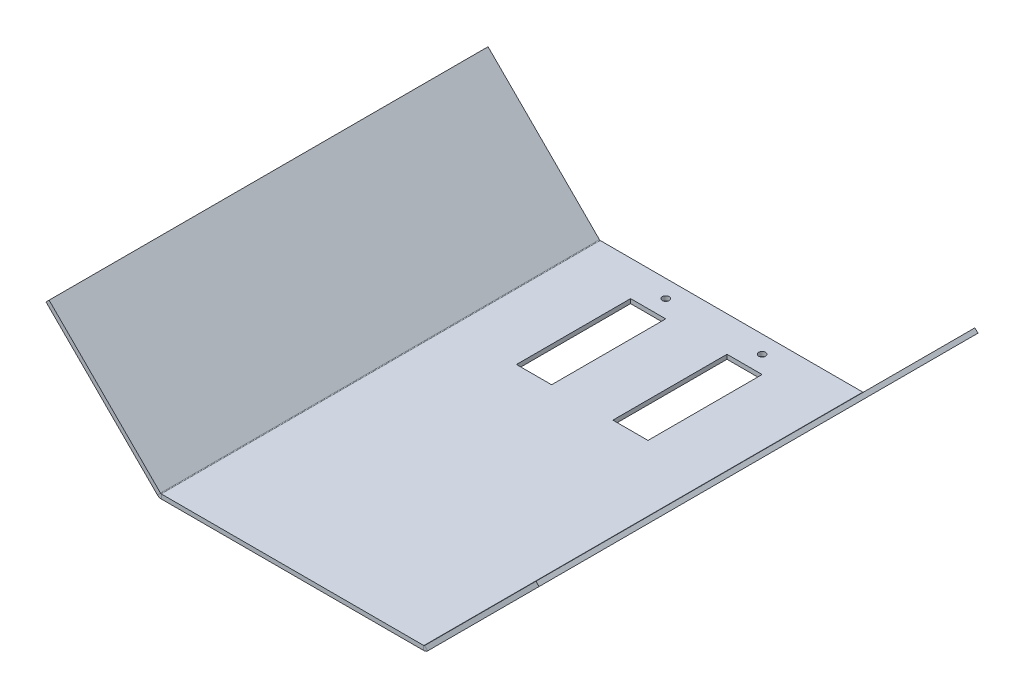
ISO-10303-21;
HEADER;
FILE_DESCRIPTION(('STEP AP214'),'2;1');
FILE_NAME('part.step','',(''),(''),'','','');
FILE_SCHEMA(('AUTOMOTIVE_DESIGN { 1 0 10303 214 1 1 1 1 }'));
ENDSEC;
DATA;
#1=APPLICATION_CONTEXT('core data for automotive mechanical design processes');
#2=APPLICATION_PROTOCOL_DEFINITION('international standard','automotive_design',2000,#1);
#3=PRODUCT_CONTEXT('',#1,'mechanical');
#4=PRODUCT('Part','Part','',(#3));
#5=PRODUCT_RELATED_PRODUCT_CATEGORY('part','',(#4));
#6=PRODUCT_DEFINITION_FORMATION('','',#4);
#7=PRODUCT_DEFINITION_CONTEXT('part definition',#1,'design');
#8=PRODUCT_DEFINITION('design','',#6,#7);
#9=PRODUCT_DEFINITION_SHAPE('','',#8);
#10=(LENGTH_UNIT() NAMED_UNIT(*) SI_UNIT(.MILLI.,.METRE.));
#11=(NAMED_UNIT(*) PLANE_ANGLE_UNIT() SI_UNIT($,.RADIAN.));
#12=(NAMED_UNIT(*) SI_UNIT($,.STERADIAN.) SOLID_ANGLE_UNIT());
#13=UNCERTAINTY_MEASURE_WITH_UNIT(LENGTH_MEASURE(1.E-05),#10,'distance_accuracy_value','');
#14=(GEOMETRIC_REPRESENTATION_CONTEXT(3) GLOBAL_UNCERTAINTY_ASSIGNED_CONTEXT((#13)) GLOBAL_UNIT_ASSIGNED_CONTEXT((#10,
#11,#12)) REPRESENTATION_CONTEXT('',''));
#15=CARTESIAN_POINT('',(0.,0.,0.));
#16=DIRECTION('',(0.,0.,1.));
#17=DIRECTION('',(1.,0.,0.));
#18=AXIS2_PLACEMENT_3D('',#15,#16,#17);
#19=CARTESIAN_POINT('',(0.336672783496916,0.,158.75));
#20=DIRECTION('',(0.,0.,1.));
#21=DIRECTION('',(1.,0.,0.));
#22=AXIS2_PLACEMENT_3D('',#19,#20,#21);
#23=PLANE('',#22);
#24=DIRECTION('',(0.,-1.,0.));
#25=VECTOR('',#24,1.);
#26=CARTESIAN_POINT('',(0.336672783496916,0.,158.75));
#27=LINE('',#26,#25);
#28=CARTESIAN_POINT('',(0.336672783496916,0.,158.75));
#29=VERTEX_POINT('',#28);
#30=CARTESIAN_POINT('',(0.336672783496916,-3.175,158.75));
#31=VERTEX_POINT('',#30);
#32=EDGE_CURVE('E11',#29,#31,#27,.T.);
#33=ORIENTED_EDGE('',*,*,#32,.F.);
#34=CARTESIAN_POINT('',(0.336672783496916,0.812799999999973,158.75));
#35=DIRECTION('',(0.,0.,-1.));
#36=DIRECTION('',(-1.,0.,0.));
#37=AXIS2_PLACEMENT_3D('',#34,#35,#36);
#38=CIRCLE('',#37,0.8128);
#39=CARTESIAN_POINT('',(-0.238063608251474,0.238063608251488,158.75));
#40=VERTEX_POINT('',#39);
#41=EDGE_CURVE('E326',#40,#29,#38,.F.);
#42=ORIENTED_EDGE('',*,*,#41,.F.);
#43=DIRECTION('',(0.707106781186488,0.707106781186607,0.));
#44=VECTOR('',#43,1.);
#45=CARTESIAN_POINT('',(-2.48312763851856,-2.00700042201598,158.75));
#46=LINE('',#45,#44);
#47=CARTESIAN_POINT('',(-2.48312763851856,-2.00700042201598,158.75));
#48=VERTEX_POINT('',#47);
#49=EDGE_CURVE('E51',#48,#40,#46,.T.);
#50=ORIENTED_EDGE('',*,*,#49,.F.);
#51=CARTESIAN_POINT('',(0.336672783496916,0.812799999999973,158.75));
#52=DIRECTION('',(0.,0.,1.));
#53=DIRECTION('',(1.,0.,0.));
#54=AXIS2_PLACEMENT_3D('',#51,#52,#53);
#55=CIRCLE('',#54,3.9878);
#56=EDGE_CURVE('E338',#48,#31,#55,.T.);
#57=ORIENTED_EDGE('',*,*,#56,.T.);
#58=EDGE_LOOP('',(#33,#42,#50,#57));
#59=FACE_BOUND('',#58,.T.);
#60=ADVANCED_FACE('F44',(#59),#23,.T.);
#61=CARTESIAN_POINT('',(-2.48312763851856,-2.00700042201598,158.75));
#62=DIRECTION('',(0.,0.,1.));
#63=DIRECTION('',(1.,0.,0.));
#64=AXIS2_PLACEMENT_3D('',#61,#62,#63);
#65=PLANE('',#64);
#66=DIRECTION('',(1.,0.,0.));
#67=VECTOR('',#66,1.);
#68=CARTESIAN_POINT('',(0.,0.,158.75));
#69=LINE('',#68,#67);
#70=CARTESIAN_POINT('',(190.163327216503,0.,158.75));
#71=VERTEX_POINT('',#70);
#72=EDGE_CURVE('E323',#29,#71,#69,.T.);
#73=ORIENTED_EDGE('',*,*,#72,.F.);
#74=ORIENTED_EDGE('',*,*,#32,.T.);
#75=DIRECTION('',(1.,0.,0.));
#76=VECTOR('',#75,1.);
#77=CARTESIAN_POINT('',(0.,-3.175,158.75));
#78=LINE('',#77,#76);
#79=CARTESIAN_POINT('',(190.163327216503,-3.175,158.75));
#80=VERTEX_POINT('',#79);
#81=EDGE_CURVE('E341',#31,#80,#78,.T.);
#82=ORIENTED_EDGE('',*,*,#81,.T.);
#83=DIRECTION('',(0.,1.,0.));
#84=VECTOR('',#83,1.);
#85=CARTESIAN_POINT('',(190.163327216503,-3.175,158.75));
#86=LINE('',#85,#84);
#87=EDGE_CURVE('E417',#80,#71,#86,.T.);
#88=ORIENTED_EDGE('',*,*,#87,.T.);
#89=EDGE_LOOP('',(#73,#74,#82,#88));
#90=FACE_BOUND('',#89,.T.);
#91=ADVANCED_FACE('F459',(#90),#65,.T.);
#92=CARTESIAN_POINT('',(-0.238063608251474,0.238063608251488,-158.75));
#93=DIRECTION('',(0.,0.,-1.));
#94=DIRECTION('',(-1.,0.,0.));
#95=AXIS2_PLACEMENT_3D('',#92,#93,#94);
#96=PLANE('',#95);
#97=DIRECTION('',(-0.707106781186488,-0.707106781186607,0.));
#98=VECTOR('',#97,1.);
#99=CARTESIAN_POINT('',(-0.238063608251474,0.238063608251488,-158.75));
#100=LINE('',#99,#98);
#101=CARTESIAN_POINT('',(-0.238063608251474,0.238063608251488,-158.75));
#102=VERTEX_POINT('',#101);
#103=CARTESIAN_POINT('',(-2.48312763851856,-2.00700042201598,-158.75));
#104=VERTEX_POINT('',#103);
#105=EDGE_CURVE('E423',#102,#104,#100,.T.);
#106=ORIENTED_EDGE('',*,*,#105,.F.);
#107=CARTESIAN_POINT('',(0.336672783496916,0.812799999999973,-158.75));
#108=DIRECTION('',(0.,0.,-1.));
#109=DIRECTION('',(-1.,0.,0.));
#110=AXIS2_PLACEMENT_3D('',#107,#108,#109);
#111=CIRCLE('',#110,0.8128);
#112=CARTESIAN_POINT('',(0.336672783496916,0.,-158.75));
#113=VERTEX_POINT('',#112);
#114=EDGE_CURVE('E362',#102,#113,#111,.F.);
#115=ORIENTED_EDGE('',*,*,#114,.T.);
#116=DIRECTION('',(0.,1.,0.));
#117=VECTOR('',#116,1.);
#118=CARTESIAN_POINT('',(0.336672783496916,-3.175,-158.75));
#119=LINE('',#118,#117);
#120=CARTESIAN_POINT('',(0.336672783496916,-3.175,-158.75));
#121=VERTEX_POINT('',#120);
#122=EDGE_CURVE('E421',#121,#113,#119,.T.);
#123=ORIENTED_EDGE('',*,*,#122,.F.);
#124=CARTESIAN_POINT('',(0.336672783496916,0.812799999999973,-158.75));
#125=DIRECTION('',(0.,0.,1.));
#126=DIRECTION('',(1.,0.,0.));
#127=AXIS2_PLACEMENT_3D('',#124,#125,#126);
#128=CIRCLE('',#127,3.9878);
#129=EDGE_CURVE('E374',#104,#121,#128,.T.);
#130=ORIENTED_EDGE('',*,*,#129,.F.);
#131=EDGE_LOOP('',(#106,#115,#123,#130));
#132=FACE_BOUND('',#131,.T.);
#133=ADVANCED_FACE('F467',(#132),#96,.T.);
#134=CARTESIAN_POINT('',(0.336672783496916,-3.175,-158.75));
#135=DIRECTION('',(0.,0.,-1.));
#136=DIRECTION('',(-1.,0.,0.));
#137=AXIS2_PLACEMENT_3D('',#134,#135,#136);
#138=PLANE('',#137);
#139=DIRECTION('',(0.707106781186547,-0.707106781186549,0.));
#140=VECTOR('',#139,1.);
#141=CARTESIAN_POINT('',(-80.8223050896222,80.8223050896225,-158.75));
#142=LINE('',#141,#140);
#143=CARTESIAN_POINT('',(-80.8223050896222,80.8223050896225,-158.75));
#144=VERTEX_POINT('',#143);
#145=EDGE_CURVE('E365',#144,#102,#142,.T.);
#146=ORIENTED_EDGE('',*,*,#145,.T.);
#147=ORIENTED_EDGE('',*,*,#105,.T.);
#148=DIRECTION('',(0.707106781186546,-0.707106781186549,0.));
#149=VECTOR('',#148,1.);
#150=CARTESIAN_POINT('',(-83.0673691198895,78.5772410593552,-158.75));
#151=LINE('',#150,#149);
#152=CARTESIAN_POINT('',(-83.0673691198895,78.5772410593552,-158.75));
#153=VERTEX_POINT('',#152);
#154=EDGE_CURVE('E371',#153,#104,#151,.T.);
#155=ORIENTED_EDGE('',*,*,#154,.F.);
#156=DIRECTION('',(0.70710678118655,0.707106781186545,0.));
#157=VECTOR('',#156,1.);
#158=CARTESIAN_POINT('',(-83.0673691198895,78.5772410593552,-158.75));
#159=LINE('',#158,#157);
#160=EDGE_CURVE('E368',#153,#144,#159,.T.);
#161=ORIENTED_EDGE('',*,*,#160,.T.);
#162=EDGE_LOOP('',(#146,#147,#155,#161));
#163=FACE_BOUND('',#162,.T.);
#164=ADVANCED_FACE('F469',(#163),#138,.T.);
#165=CARTESIAN_POINT('',(190.738063608252,0.238063608251572,158.75));
#166=DIRECTION('',(0.,0.,1.));
#167=DIRECTION('',(1.,0.,0.));
#168=AXIS2_PLACEMENT_3D('',#165,#166,#167);
#169=PLANE('',#168);
#170=DIRECTION('',(0.707106781186547,-0.707106781186548,0.));
#171=VECTOR('',#170,1.);
#172=CARTESIAN_POINT('',(190.738063608252,0.238063608251572,158.75));
#173=LINE('',#172,#171);
#174=CARTESIAN_POINT('',(190.738063608252,0.238063608251572,158.75));
#175=VERTEX_POINT('',#174);
#176=CARTESIAN_POINT('',(192.983127638519,-2.00700042201571,158.75));
#177=VERTEX_POINT('',#176);
#178=EDGE_CURVE('E419',#175,#177,#173,.T.);
#179=ORIENTED_EDGE('',*,*,#178,.F.);
#180=CARTESIAN_POINT('',(190.163327216503,0.812800000000002,158.75));
#181=DIRECTION('',(0.,0.,-1.));
#182=DIRECTION('',(-1.,0.,0.));
#183=AXIS2_PLACEMENT_3D('',#180,#181,#182);
#184=CIRCLE('',#183,0.8128);
#185=EDGE_CURVE('E320',#71,#175,#184,.F.);
#186=ORIENTED_EDGE('',*,*,#185,.F.);
#187=ORIENTED_EDGE('',*,*,#87,.F.);
#188=CARTESIAN_POINT('',(190.163327216503,0.812800000000002,158.75));
#189=DIRECTION('',(0.,0.,1.));
#190=DIRECTION('',(1.,0.,0.));
#191=AXIS2_PLACEMENT_3D('',#188,#189,#190);
#192=CIRCLE('',#191,3.9878);
#193=EDGE_CURVE('E344',#80,#177,#192,.T.);
#194=ORIENTED_EDGE('',*,*,#193,.T.);
#195=EDGE_LOOP('',(#179,#186,#187,#194));
#196=FACE_BOUND('',#195,.T.);
#197=ADVANCED_FACE('F471',(#196),#169,.T.);
#198=CARTESIAN_POINT('',(190.163327216503,-3.175,158.75));
#199=DIRECTION('',(0.,0.,1.));
#200=DIRECTION('',(1.,0.,0.));
#201=AXIS2_PLACEMENT_3D('',#198,#199,#200);
#202=PLANE('',#201);
#203=DIRECTION('',(0.707106781186546,0.707106781186549,0.));
#204=VECTOR('',#203,1.);
#205=CARTESIAN_POINT('',(190.5,0.,158.75));
#206=LINE('',#205,#204);
#207=CARTESIAN_POINT('',(271.322305089622,80.8223050896225,158.75));
#208=VERTEX_POINT('',#207);
#209=EDGE_CURVE('E317',#175,#208,#206,.T.);
#210=ORIENTED_EDGE('',*,*,#209,.F.);
#211=ORIENTED_EDGE('',*,*,#178,.T.);
#212=DIRECTION('',(0.707106781186546,0.707106781186549,0.));
#213=VECTOR('',#212,1.);
#214=CARTESIAN_POINT('',(192.745064030267,-2.24506403026728,158.75));
#215=LINE('',#214,#213);
#216=CARTESIAN_POINT('',(273.56736911989,78.5772410593552,158.75));
#217=VERTEX_POINT('',#216);
#218=EDGE_CURVE('E311',#177,#217,#215,.T.);
#219=ORIENTED_EDGE('',*,*,#218,.T.);
#220=DIRECTION('',(0.707106781186552,-0.707106781186543,0.));
#221=VECTOR('',#220,1.);
#222=CARTESIAN_POINT('',(271.322305089622,80.8223050896225,158.75));
#223=LINE('',#222,#221);
#224=EDGE_CURVE('E313',#208,#217,#223,.T.);
#225=ORIENTED_EDGE('',*,*,#224,.F.);
#226=EDGE_LOOP('',(#210,#211,#219,#225));
#227=FACE_BOUND('',#226,.T.);
#228=ADVANCED_FACE('F477',(#227),#202,.T.);
#229=CARTESIAN_POINT('',(190.163327216503,0.,-158.75));
#230=DIRECTION('',(0.,0.,-1.));
#231=DIRECTION('',(-1.,0.,0.));
#232=AXIS2_PLACEMENT_3D('',#229,#230,#231);
#233=PLANE('',#232);
#234=DIRECTION('',(0.,-1.,0.));
#235=VECTOR('',#234,1.);
#236=CARTESIAN_POINT('',(190.163327216503,0.,-158.75));
#237=LINE('',#236,#235);
#238=CARTESIAN_POINT('',(190.163327216503,0.,-158.75));
#239=VERTEX_POINT('',#238);
#240=CARTESIAN_POINT('',(190.163327216503,-3.175,-158.75));
#241=VERTEX_POINT('',#240);
#242=EDGE_CURVE('E415',#239,#241,#237,.T.);
#243=ORIENTED_EDGE('',*,*,#242,.F.);
#244=CARTESIAN_POINT('',(190.163327216503,0.812800000000002,-158.75));
#245=DIRECTION('',(0.,0.,-1.));
#246=DIRECTION('',(-1.,0.,0.));
#247=AXIS2_PLACEMENT_3D('',#244,#245,#246);
#248=CIRCLE('',#247,0.8128);
#249=CARTESIAN_POINT('',(190.738063608252,0.238063608251572,-158.75));
#250=VERTEX_POINT('',#249);
#251=EDGE_CURVE('E356',#239,#250,#248,.F.);
#252=ORIENTED_EDGE('',*,*,#251,.T.);
#253=DIRECTION('',(-0.707106781186547,0.707106781186548,0.));
#254=VECTOR('',#253,1.);
#255=CARTESIAN_POINT('',(192.983127638519,-2.00700042201571,-158.75));
#256=LINE('',#255,#254);
#257=CARTESIAN_POINT('',(192.983127638519,-2.00700042201571,-158.75));
#258=VERTEX_POINT('',#257);
#259=EDGE_CURVE('E413',#258,#250,#256,.T.);
#260=ORIENTED_EDGE('',*,*,#259,.F.);
#261=CARTESIAN_POINT('',(190.163327216503,0.812800000000002,-158.75));
#262=DIRECTION('',(0.,0.,1.));
#263=DIRECTION('',(1.,0.,0.));
#264=AXIS2_PLACEMENT_3D('',#261,#262,#263);
#265=CIRCLE('',#264,3.9878);
#266=EDGE_CURVE('E314',#241,#258,#265,.T.);
#267=ORIENTED_EDGE('',*,*,#266,.F.);
#268=EDGE_LOOP('',(#243,#252,#260,#267));
#269=FACE_BOUND('',#268,.T.);
#270=ADVANCED_FACE('F515',(#269),#233,.T.);
#271=CARTESIAN_POINT('',(192.983127638519,-2.00700042201571,-158.75));
#272=DIRECTION('',(0.,0.,-1.));
#273=DIRECTION('',(-1.,0.,0.));
#274=AXIS2_PLACEMENT_3D('',#271,#272,#273);
#275=PLANE('',#274);
#276=DIRECTION('',(1.,0.,0.));
#277=VECTOR('',#276,1.);
#278=CARTESIAN_POINT('',(0.,0.,-158.75));
#279=LINE('',#278,#277);
#280=EDGE_CURVE('E359',#113,#239,#279,.T.);
#281=ORIENTED_EDGE('',*,*,#280,.T.);
#282=ORIENTED_EDGE('',*,*,#242,.T.);
#283=DIRECTION('',(1.,0.,0.));
#284=VECTOR('',#283,1.);
#285=CARTESIAN_POINT('',(0.,-3.175,-158.75));
#286=LINE('',#285,#284);
#287=EDGE_CURVE('E377',#121,#241,#286,.T.);
#288=ORIENTED_EDGE('',*,*,#287,.F.);
#289=ORIENTED_EDGE('',*,*,#122,.T.);
#290=EDGE_LOOP('',(#281,#282,#288,#289));
#291=FACE_BOUND('',#290,.T.);
#292=ADVANCED_FACE('F526',(#291),#275,.T.);
#293=CARTESIAN_POINT('',(192.745064030267,-2.24506403026728,158.75));
#294=DIRECTION('',(-0.707106781186549,0.707106781186546,0.));
#295=DIRECTION('',(-0.707106781186546,-0.707106781186549,0.));
#296=AXIS2_PLACEMENT_3D('',#293,#294,#295);
#297=PLANE('',#296);
#298=DIRECTION('',(-0.707106781186546,-0.707106781186549,0.));
#299=VECTOR('',#298,1.);
#300=CARTESIAN_POINT('',(204.801696022067,9.81156796153279,-150.8125));
#301=LINE('',#300,#299);
#302=CARTESIAN_POINT('',(207.046759442645,12.05663138211,-150.8125));
#303=VERTEX_POINT('',#302);
#304=CARTESIAN_POINT('',(204.801695412377,9.81156735184285,-150.8125));
#305=VERTEX_POINT('',#304);
#306=EDGE_CURVE('E205',#303,#305,#301,.T.);
#307=ORIENTED_EDGE('',*,*,#306,.T.);
#308=CARTESIAN_POINT('',(204.801695412377,9.81156735184285,-146.05));
#309=DIRECTION('',(-0.707106781186549,0.707106781186546,0.));
#310=DIRECTION('',(-0.707106781186546,-0.707106781186549,0.));
#311=AXIS2_PLACEMENT_3D('',#308,#309,#310);
#312=ELLIPSE('',#311,6.73519209080189,4.76250000000001);
#313=CARTESIAN_POINT('',(204.801695412378,9.81156735184333,-141.2875));
#314=VERTEX_POINT('',#313);
#315=EDGE_CURVE('E216',#305,#314,#312,.T.);
#316=ORIENTED_EDGE('',*,*,#315,.T.);
#317=DIRECTION('',(0.707106781186545,0.70710678118655,0.));
#318=VECTOR('',#317,1.);
#319=CARTESIAN_POINT('',(207.046757967817,12.0566299072826,-141.2875));
#320=LINE('',#319,#318);
#321=CARTESIAN_POINT('',(207.046759442645,12.0566313821106,-141.2875));
#322=VERTEX_POINT('',#321);
#323=EDGE_CURVE('E206',#314,#322,#320,.T.);
#324=ORIENTED_EDGE('',*,*,#323,.T.);
#325=CARTESIAN_POINT('',(207.046759442645,12.0566313821101,-146.05));
#326=DIRECTION('',(-0.707106781186549,0.707106781186546,0.));
#327=DIRECTION('',(-0.707106781186546,-0.707106781186549,0.));
#328=AXIS2_PLACEMENT_3D('',#325,#326,#327);
#329=ELLIPSE('',#328,6.73519209080189,4.76250000000001);
#330=EDGE_CURVE('E200',#322,#303,#329,.T.);
#331=ORIENTED_EDGE('',*,*,#330,.T.);
#332=EDGE_LOOP('',(#307,#316,#324,#331));
#333=FACE_BOUND('',#332,.T.);
#334=DIRECTION('',(0.707106781186546,0.707106781186549,0.));
#335=VECTOR('',#334,1.);
#336=CARTESIAN_POINT('',(192.745064030267,-2.24506403026728,-158.75));
#337=LINE('',#336,#335);
#338=CARTESIAN_POINT('',(273.56736911989,78.5772410593552,-158.75));
#339=VERTEX_POINT('',#338);
#340=EDGE_CURVE('E304',#258,#339,#337,.T.);
#341=ORIENTED_EDGE('',*,*,#340,.T.);
#342=DIRECTION('',(0.,0.,-1.));
#343=VECTOR('',#342,1.);
#344=CARTESIAN_POINT('',(273.56736911989,78.5772410593552,158.75));
#345=LINE('',#344,#343);
#346=EDGE_CURVE('E411',#217,#339,#345,.T.);
#347=ORIENTED_EDGE('',*,*,#346,.F.);
#348=ORIENTED_EDGE('',*,*,#218,.F.);
#349=DIRECTION('',(0.,0.,-1.));
#350=VECTOR('',#349,1.);
#351=CARTESIAN_POINT('',(192.983127638519,-2.00700042201571,158.75));
#352=LINE('',#351,#350);
#353=EDGE_CURVE('E347',#177,#258,#352,.T.);
#354=ORIENTED_EDGE('',*,*,#353,.T.);
#355=EDGE_LOOP('',(#341,#347,#348,#354));
#356=FACE_BOUND('',#355,.T.);
#357=ADVANCED_FACE('F219',(#333,#356),#297,.F.);
#358=CARTESIAN_POINT('',(271.322305089622,80.8223050896225,158.75));
#359=DIRECTION('',(0.707106781186543,0.707106781186552,0.));
#360=DIRECTION('',(-0.707106781186552,0.707106781186543,0.));
#361=AXIS2_PLACEMENT_3D('',#358,#359,#360);
#362=PLANE('',#361);
#363=DIRECTION('',(0.707106781186552,-0.707106781186543,0.));
#364=VECTOR('',#363,1.);
#365=CARTESIAN_POINT('',(271.322305089622,80.8223050896225,-158.75));
#366=LINE('',#365,#364);
#367=CARTESIAN_POINT('',(271.322305089622,80.8223050896225,-158.75));
#368=VERTEX_POINT('',#367);
#369=EDGE_CURVE('E350',#368,#339,#366,.T.);
#370=ORIENTED_EDGE('',*,*,#369,.F.);
#371=DIRECTION('',(0.,0.,-1.));
#372=VECTOR('',#371,1.);
#373=CARTESIAN_POINT('',(271.322305089622,80.8223050896225,158.75));
#374=LINE('',#373,#372);
#375=EDGE_CURVE('E409',#208,#368,#374,.T.);
#376=ORIENTED_EDGE('',*,*,#375,.F.);
#377=ORIENTED_EDGE('',*,*,#224,.T.);
#378=ORIENTED_EDGE('',*,*,#346,.T.);
#379=EDGE_LOOP('',(#370,#376,#377,#378));
#380=FACE_BOUND('',#379,.T.);
#381=ADVANCED_FACE('F547',(#380),#362,.T.);
#382=CARTESIAN_POINT('',(190.5,0.,158.75));
#383=DIRECTION('',(-0.707106781186549,0.707106781186546,0.));
#384=DIRECTION('',(-0.707106781186546,-0.707106781186549,0.));
#385=AXIS2_PLACEMENT_3D('',#382,#383,#384);
#386=PLANE('',#385);
#387=CARTESIAN_POINT('',(202.55663138211,12.0566313821101,-146.05));
#388=DIRECTION('',(-0.707106781186549,0.707106781186546,0.));
#389=DIRECTION('',(-0.707106781186546,-0.707106781186549,0.));
#390=AXIS2_PLACEMENT_3D('',#387,#388,#389);
#391=ELLIPSE('',#390,6.73519209080189,4.76250000000001);
#392=CARTESIAN_POINT('',(202.55663138211,12.0566313821101,-150.8125));
#393=VERTEX_POINT('',#392);
#394=CARTESIAN_POINT('',(202.55663138211,12.0566313821104,-141.2875));
#395=VERTEX_POINT('',#394);
#396=EDGE_CURVE('E221',#393,#395,#391,.T.);
#397=ORIENTED_EDGE('',*,*,#396,.F.);
#398=DIRECTION('',(-0.707106781186547,-0.707106781186548,0.));
#399=VECTOR('',#398,1.);
#400=CARTESIAN_POINT('',(203.679163397244,13.1791633972438,-150.8125));
#401=LINE('',#400,#399);
#402=CARTESIAN_POINT('',(204.801695412377,14.3016954123774,-150.8125));
#403=VERTEX_POINT('',#402);
#404=EDGE_CURVE('E223',#403,#393,#401,.T.);
#405=ORIENTED_EDGE('',*,*,#404,.F.);
#406=CARTESIAN_POINT('',(204.801695412377,14.3016954123774,-146.05));
#407=DIRECTION('',(-0.707106781186549,0.707106781186546,0.));
#408=DIRECTION('',(-0.707106781186546,-0.707106781186549,0.));
#409=AXIS2_PLACEMENT_3D('',#406,#407,#408);
#410=ELLIPSE('',#409,6.73519209080189,4.76250000000001);
#411=CARTESIAN_POINT('',(204.801695412378,14.3016954123775,-141.2875));
#412=VERTEX_POINT('',#411);
#413=EDGE_CURVE('E232',#412,#403,#410,.T.);
#414=ORIENTED_EDGE('',*,*,#413,.F.);
#415=DIRECTION('',(-0.707106781186547,-0.707106781186548,0.));
#416=VECTOR('',#415,1.);
#417=CARTESIAN_POINT('',(203.679163397244,13.1791633972438,-141.2875));
#418=LINE('',#417,#416);
#419=EDGE_CURVE('E213',#395,#412,#418,.F.);
#420=ORIENTED_EDGE('',*,*,#419,.F.);
#421=EDGE_LOOP('',(#397,#405,#414,#420));
#422=FACE_BOUND('',#421,.T.);
#423=DIRECTION('',(0.707106781186546,0.707106781186549,0.));
#424=VECTOR('',#423,1.);
#425=CARTESIAN_POINT('',(190.5,0.,-158.75));
#426=LINE('',#425,#424);
#427=EDGE_CURVE('E353',#250,#368,#426,.T.);
#428=ORIENTED_EDGE('',*,*,#427,.F.);
#429=DIRECTION('',(0.,0.,-1.));
#430=VECTOR('',#429,1.);
#431=CARTESIAN_POINT('',(190.738063608252,0.238063608251572,158.75));
#432=LINE('',#431,#430);
#433=EDGE_CURVE('E406',#175,#250,#432,.T.);
#434=ORIENTED_EDGE('',*,*,#433,.F.);
#435=ORIENTED_EDGE('',*,*,#209,.T.);
#436=ORIENTED_EDGE('',*,*,#375,.T.);
#437=EDGE_LOOP('',(#428,#434,#435,#436));
#438=FACE_BOUND('',#437,.T.);
#439=ADVANCED_FACE('F558',(#422,#438),#386,.T.);
#440=CARTESIAN_POINT('',(190.163327216503,0.812800000000002,158.75));
#441=DIRECTION('',(0.,0.,-1.));
#442=DIRECTION('',(-1.,0.,0.));
#443=AXIS2_PLACEMENT_3D('',#440,#441,#442);
#444=CYLINDRICAL_SURFACE('',#443,0.8128);
#445=ORIENTED_EDGE('',*,*,#251,.F.);
#446=DIRECTION('',(0.,0.,-1.));
#447=VECTOR('',#446,1.);
#448=CARTESIAN_POINT('',(190.163327216503,0.,158.75));
#449=LINE('',#448,#447);
#450=EDGE_CURVE('E403',#71,#239,#449,.T.);
#451=ORIENTED_EDGE('',*,*,#450,.F.);
#452=ORIENTED_EDGE('',*,*,#185,.T.);
#453=ORIENTED_EDGE('',*,*,#433,.T.);
#454=EDGE_LOOP('',(#445,#451,#452,#453));
#455=FACE_BOUND('',#454,.T.);
#456=ADVANCED_FACE('F569',(#455),#444,.F.);
#457=CARTESIAN_POINT('',(0.,0.,158.75));
#458=DIRECTION('',(0.,1.,0.));
#459=DIRECTION('',(0.,0.,1.));
#460=AXIS2_PLACEMENT_3D('',#457,#458,#459);
#461=PLANE('',#460);
#462=DIRECTION('',(0.,0.,1.));
#463=VECTOR('',#462,1.);
#464=CARTESIAN_POINT('',(117.4115,0.,-133.35));
#465=LINE('',#464,#463);
#466=CARTESIAN_POINT('',(117.4115,0.,-133.35));
#467=VERTEX_POINT('',#466);
#468=CARTESIAN_POINT('',(117.4115,0.,-50.8));
#469=VERTEX_POINT('',#468);
#470=EDGE_CURVE('E262',#467,#469,#465,.T.);
#471=ORIENTED_EDGE('',*,*,#470,.F.);
#472=DIRECTION('',(-1.,0.,0.));
#473=VECTOR('',#472,1.);
#474=CARTESIAN_POINT('',(117.4115,0.,-133.35));
#475=LINE('',#474,#473);
#476=CARTESIAN_POINT('',(142.8115,0.,-133.35));
#477=VERTEX_POINT('',#476);
#478=EDGE_CURVE('E252',#477,#467,#475,.T.);
#479=ORIENTED_EDGE('',*,*,#478,.F.);
#480=DIRECTION('',(0.,0.,-1.));
#481=VECTOR('',#480,1.);
#482=CARTESIAN_POINT('',(142.8115,0.,-133.35));
#483=LINE('',#482,#481);
#484=CARTESIAN_POINT('',(142.8115,0.,-50.8));
#485=VERTEX_POINT('',#484);
#486=EDGE_CURVE('E255',#485,#477,#483,.T.);
#487=ORIENTED_EDGE('',*,*,#486,.F.);
#488=DIRECTION('',(1.,0.,0.));
#489=VECTOR('',#488,1.);
#490=CARTESIAN_POINT('',(117.4115,0.,-50.8));
#491=LINE('',#490,#489);
#492=EDGE_CURVE('E259',#469,#485,#491,.T.);
#493=ORIENTED_EDGE('',*,*,#492,.F.);
#494=EDGE_LOOP('',(#471,#479,#487,#493));
#495=FACE_BOUND('',#494,.T.);
#496=CARTESIAN_POINT('',(60.3885,0.,-146.05));
#497=DIRECTION('',(0.,1.,0.));
#498=DIRECTION('',(0.,0.,1.));
#499=AXIS2_PLACEMENT_3D('',#496,#497,#498);
#500=CIRCLE('',#499,2.48920000000002);
#501=CARTESIAN_POINT('',(60.3885,0.,-143.5608));
#502=VERTEX_POINT('',#501);
#503=EDGE_CURVE('E251',#502,#502,#500,.T.);
#504=ORIENTED_EDGE('',*,*,#503,.F.);
#505=EDGE_LOOP('',(#504));
#506=FACE_BOUND('',#505,.T.);
#507=CARTESIAN_POINT('',(130.1115,0.,-146.05));
#508=DIRECTION('',(0.,1.,0.));
#509=DIRECTION('',(0.,0.,1.));
#510=AXIS2_PLACEMENT_3D('',#507,#508,#509);
#511=CIRCLE('',#510,2.48920000000003);
#512=CARTESIAN_POINT('',(130.1115,0.,-143.5608));
#513=VERTEX_POINT('',#512);
#514=EDGE_CURVE('E234',#513,#513,#511,.T.);
#515=ORIENTED_EDGE('',*,*,#514,.F.);
#516=EDGE_LOOP('',(#515));
#517=FACE_BOUND('',#516,.T.);
#518=DIRECTION('',(0.,0.,1.));
#519=VECTOR('',#518,1.);
#520=CARTESIAN_POINT('',(47.6885,0.,-133.35));
#521=LINE('',#520,#519);
#522=CARTESIAN_POINT('',(47.6885,0.,-133.35));
#523=VERTEX_POINT('',#522);
#524=CARTESIAN_POINT('',(47.6885,0.,-50.8));
#525=VERTEX_POINT('',#524);
#526=EDGE_CURVE('E264',#523,#525,#521,.T.);
#527=ORIENTED_EDGE('',*,*,#526,.F.);
#528=DIRECTION('',(-1.,0.,0.));
#529=VECTOR('',#528,1.);
#530=CARTESIAN_POINT('',(47.6885,0.,-133.35));
#531=LINE('',#530,#529);
#532=CARTESIAN_POINT('',(73.0885,0.,-133.35));
#533=VERTEX_POINT('',#532);
#534=EDGE_CURVE('E283',#533,#523,#531,.T.);
#535=ORIENTED_EDGE('',*,*,#534,.F.);
#536=DIRECTION('',(0.,0.,-1.));
#537=VECTOR('',#536,1.);
#538=CARTESIAN_POINT('',(73.0885,0.,-133.35));
#539=LINE('',#538,#537);
#540=CARTESIAN_POINT('',(73.0885,0.,-50.8));
#541=VERTEX_POINT('',#540);
#542=EDGE_CURVE('E297',#541,#533,#539,.T.);
#543=ORIENTED_EDGE('',*,*,#542,.F.);
#544=DIRECTION('',(1.,0.,0.));
#545=VECTOR('',#544,1.);
#546=CARTESIAN_POINT('',(47.6885,0.,-50.8));
#547=LINE('',#546,#545);
#548=EDGE_CURVE('E294',#525,#541,#547,.T.);
#549=ORIENTED_EDGE('',*,*,#548,.F.);
#550=EDGE_LOOP('',(#527,#535,#543,#549));
#551=FACE_BOUND('',#550,.T.);
#552=ORIENTED_EDGE('',*,*,#280,.F.);
#553=DIRECTION('',(0.,0.,-1.));
#554=VECTOR('',#553,1.);
#555=CARTESIAN_POINT('',(0.336672783496916,0.,158.75));
#556=LINE('',#555,#554);
#557=EDGE_CURVE('E400',#29,#113,#556,.T.);
#558=ORIENTED_EDGE('',*,*,#557,.F.);
#559=ORIENTED_EDGE('',*,*,#72,.T.);
#560=ORIENTED_EDGE('',*,*,#450,.T.);
#561=EDGE_LOOP('',(#552,#558,#559,#560));
#562=FACE_BOUND('',#561,.T.);
#563=ADVANCED_FACE('F463',(#495,#506,#517,#551,#562),#461,.T.);
#564=CARTESIAN_POINT('',(0.336672783496916,0.812799999999973,158.75));
#565=DIRECTION('',(0.,0.,-1.));
#566=DIRECTION('',(-1.,0.,0.));
#567=AXIS2_PLACEMENT_3D('',#564,#565,#566);
#568=CYLINDRICAL_SURFACE('',#567,0.8128);
#569=ORIENTED_EDGE('',*,*,#114,.F.);
#570=DIRECTION('',(0.,0.,-1.));
#571=VECTOR('',#570,1.);
#572=CARTESIAN_POINT('',(-0.238063608251474,0.238063608251488,158.75));
#573=LINE('',#572,#571);
#574=EDGE_CURVE('E397',#40,#102,#573,.T.);
#575=ORIENTED_EDGE('',*,*,#574,.F.);
#576=ORIENTED_EDGE('',*,*,#41,.T.);
#577=ORIENTED_EDGE('',*,*,#557,.T.);
#578=EDGE_LOOP('',(#569,#575,#576,#577));
#579=FACE_BOUND('',#578,.T.);
#580=ADVANCED_FACE('F435',(#579),#568,.F.);
#581=CARTESIAN_POINT('',(-80.8223050896222,80.8223050896225,158.75));
#582=DIRECTION('',(0.707106781186549,0.707106781186546,0.));
#583=DIRECTION('',(-0.707106781186546,0.707106781186549,0.));
#584=AXIS2_PLACEMENT_3D('',#581,#582,#583);
#585=PLANE('',#584);
#586=ORIENTED_EDGE('',*,*,#145,.F.);
#587=DIRECTION('',(0.,0.,-1.));
#588=VECTOR('',#587,1.);
#589=CARTESIAN_POINT('',(-80.8223050896222,80.8223050896225,158.75));
#590=LINE('',#589,#588);
#591=CARTESIAN_POINT('',(-80.8223050896222,80.8223050896225,158.75));
#592=VERTEX_POINT('',#591);
#593=EDGE_CURVE('E395',#592,#144,#590,.T.);
#594=ORIENTED_EDGE('',*,*,#593,.F.);
#595=DIRECTION('',(0.707106781186547,-0.707106781186549,0.));
#596=VECTOR('',#595,1.);
#597=CARTESIAN_POINT('',(-80.8223050896222,80.8223050896225,158.75));
#598=LINE('',#597,#596);
#599=EDGE_CURVE('E329',#592,#40,#598,.T.);
#600=ORIENTED_EDGE('',*,*,#599,.T.);
#601=ORIENTED_EDGE('',*,*,#574,.T.);
#602=EDGE_LOOP('',(#586,#594,#600,#601));
#603=FACE_BOUND('',#602,.T.);
#604=ADVANCED_FACE('F439',(#603),#585,.T.);
#605=CARTESIAN_POINT('',(-83.0673691198895,78.5772410593552,158.75));
#606=DIRECTION('',(-0.707106781186545,0.70710678118655,0.));
#607=DIRECTION('',(-0.70710678118655,-0.707106781186545,0.));
#608=AXIS2_PLACEMENT_3D('',#605,#606,#607);
#609=PLANE('',#608);
#610=ORIENTED_EDGE('',*,*,#160,.F.);
#611=DIRECTION('',(0.,0.,-1.));
#612=VECTOR('',#611,1.);
#613=CARTESIAN_POINT('',(-83.0673691198895,78.5772410593552,158.75));
#614=LINE('',#613,#612);
#615=CARTESIAN_POINT('',(-83.0673691198895,78.5772410593552,158.75));
#616=VERTEX_POINT('',#615);
#617=EDGE_CURVE('E393',#616,#153,#614,.T.);
#618=ORIENTED_EDGE('',*,*,#617,.F.);
#619=DIRECTION('',(0.70710678118655,0.707106781186545,0.));
#620=VECTOR('',#619,1.);
#621=CARTESIAN_POINT('',(-83.0673691198895,78.5772410593552,158.75));
#622=LINE('',#621,#620);
#623=EDGE_CURVE('E332',#616,#592,#622,.T.);
#624=ORIENTED_EDGE('',*,*,#623,.T.);
#625=ORIENTED_EDGE('',*,*,#593,.T.);
#626=EDGE_LOOP('',(#610,#618,#624,#625));
#627=FACE_BOUND('',#626,.T.);
#628=ADVANCED_FACE('F442',(#627),#609,.T.);
#629=CARTESIAN_POINT('',(-83.0673691198895,78.5772410593552,158.75));
#630=DIRECTION('',(0.707106781186548,0.707106781186546,0.));
#631=DIRECTION('',(-0.707106781186546,0.707106781186549,0.));
#632=AXIS2_PLACEMENT_3D('',#629,#630,#631);
#633=PLANE('',#632);
#634=ORIENTED_EDGE('',*,*,#154,.T.);
#635=DIRECTION('',(0.,0.,-1.));
#636=VECTOR('',#635,1.);
#637=CARTESIAN_POINT('',(-2.48312763851856,-2.00700042201598,158.75));
#638=LINE('',#637,#636);
#639=EDGE_CURVE('E390',#48,#104,#638,.T.);
#640=ORIENTED_EDGE('',*,*,#639,.F.);
#641=DIRECTION('',(0.707106781186546,-0.707106781186549,0.));
#642=VECTOR('',#641,1.);
#643=CARTESIAN_POINT('',(-83.0673691198895,78.5772410593552,158.75));
#644=LINE('',#643,#642);
#645=EDGE_CURVE('E335',#616,#48,#644,.T.);
#646=ORIENTED_EDGE('',*,*,#645,.F.);
#647=ORIENTED_EDGE('',*,*,#617,.T.);
#648=EDGE_LOOP('',(#634,#640,#646,#647));
#649=FACE_BOUND('',#648,.T.);
#650=ADVANCED_FACE('F445',(#649),#633,.F.);
#651=CARTESIAN_POINT('',(0.336672783496916,0.812799999999973,158.75));
#652=DIRECTION('',(0.,0.,-1.));
#653=DIRECTION('',(-1.,0.,0.));
#654=AXIS2_PLACEMENT_3D('',#651,#652,#653);
#655=CYLINDRICAL_SURFACE('',#654,3.9878);
#656=ORIENTED_EDGE('',*,*,#129,.T.);
#657=DIRECTION('',(0.,0.,-1.));
#658=VECTOR('',#657,1.);
#659=CARTESIAN_POINT('',(0.336672783496916,-3.175,158.75));
#660=LINE('',#659,#658);
#661=EDGE_CURVE('E387',#31,#121,#660,.T.);
#662=ORIENTED_EDGE('',*,*,#661,.F.);
#663=ORIENTED_EDGE('',*,*,#56,.F.);
#664=ORIENTED_EDGE('',*,*,#639,.T.);
#665=EDGE_LOOP('',(#656,#662,#663,#664));
#666=FACE_BOUND('',#665,.T.);
#667=ADVANCED_FACE('F450',(#666),#655,.T.);
#668=CARTESIAN_POINT('',(0.,-3.175,158.75));
#669=DIRECTION('',(0.,1.,0.));
#670=DIRECTION('',(0.,0.,1.));
#671=AXIS2_PLACEMENT_3D('',#668,#669,#670);
#672=PLANE('',#671);
#673=DIRECTION('',(-1.,0.,0.));
#674=VECTOR('',#673,1.);
#675=CARTESIAN_POINT('',(117.4115,-3.17500000000003,-133.35));
#676=LINE('',#675,#674);
#677=CARTESIAN_POINT('',(142.8115,-3.17500000000003,-133.35));
#678=VERTEX_POINT('',#677);
#679=CARTESIAN_POINT('',(117.4115,-3.17500000000003,-133.35));
#680=VERTEX_POINT('',#679);
#681=EDGE_CURVE('E244',#678,#680,#676,.T.);
#682=ORIENTED_EDGE('',*,*,#681,.T.);
#683=DIRECTION('',(0.,0.,1.));
#684=VECTOR('',#683,1.);
#685=CARTESIAN_POINT('',(117.4115,-3.17500000000003,-133.35));
#686=LINE('',#685,#684);
#687=CARTESIAN_POINT('',(117.4115,-3.17500000000003,-50.8));
#688=VERTEX_POINT('',#687);
#689=EDGE_CURVE('E256',#680,#688,#686,.T.);
#690=ORIENTED_EDGE('',*,*,#689,.T.);
#691=DIRECTION('',(1.,0.,0.));
#692=VECTOR('',#691,1.);
#693=CARTESIAN_POINT('',(117.4115,-3.17500000000003,-50.8));
#694=LINE('',#693,#692);
#695=CARTESIAN_POINT('',(142.8115,-3.175,-50.8));
#696=VERTEX_POINT('',#695);
#697=EDGE_CURVE('E270',#688,#696,#694,.T.);
#698=ORIENTED_EDGE('',*,*,#697,.T.);
#699=DIRECTION('',(0.,0.,-1.));
#700=VECTOR('',#699,1.);
#701=CARTESIAN_POINT('',(142.8115,-3.17500000000003,-133.35));
#702=LINE('',#701,#700);
#703=EDGE_CURVE('E267',#696,#678,#702,.T.);
#704=ORIENTED_EDGE('',*,*,#703,.T.);
#705=EDGE_LOOP('',(#682,#690,#698,#704));
#706=FACE_BOUND('',#705,.T.);
#707=CARTESIAN_POINT('',(60.3885,-3.17500000000003,-146.05));
#708=DIRECTION('',(0.,1.,0.));
#709=DIRECTION('',(0.,0.,1.));
#710=AXIS2_PLACEMENT_3D('',#707,#708,#709);
#711=CIRCLE('',#710,2.48920000000002);
#712=CARTESIAN_POINT('',(60.3885,-3.17500000000003,-143.5608));
#713=VERTEX_POINT('',#712);
#714=EDGE_CURVE('E237',#713,#713,#711,.T.);
#715=ORIENTED_EDGE('',*,*,#714,.T.);
#716=EDGE_LOOP('',(#715));
#717=FACE_BOUND('',#716,.T.);
#718=CARTESIAN_POINT('',(130.1115,-3.17500000000003,-146.05));
#719=DIRECTION('',(0.,1.,0.));
#720=DIRECTION('',(0.,0.,1.));
#721=AXIS2_PLACEMENT_3D('',#718,#719,#720);
#722=CIRCLE('',#721,2.48920000000003);
#723=CARTESIAN_POINT('',(130.1115,-3.17500000000003,-143.5608));
#724=VERTEX_POINT('',#723);
#725=EDGE_CURVE('E238',#724,#724,#722,.T.);
#726=ORIENTED_EDGE('',*,*,#725,.T.);
#727=EDGE_LOOP('',(#726));
#728=FACE_BOUND('',#727,.T.);
#729=DIRECTION('',(-1.,0.,0.));
#730=VECTOR('',#729,1.);
#731=CARTESIAN_POINT('',(47.6885,-3.17500000000003,-133.35));
#732=LINE('',#731,#730);
#733=CARTESIAN_POINT('',(73.0885,-3.17500000000003,-133.35));
#734=VERTEX_POINT('',#733);
#735=CARTESIAN_POINT('',(47.6885,-3.17500000000003,-133.35));
#736=VERTEX_POINT('',#735);
#737=EDGE_CURVE('E289',#734,#736,#732,.T.);
#738=ORIENTED_EDGE('',*,*,#737,.T.);
#739=DIRECTION('',(0.,0.,1.));
#740=VECTOR('',#739,1.);
#741=CARTESIAN_POINT('',(47.6885,-3.17500000000003,-133.35));
#742=LINE('',#741,#740);
#743=CARTESIAN_POINT('',(47.6885,-3.17500000000003,-50.8));
#744=VERTEX_POINT('',#743);
#745=EDGE_CURVE('E279',#736,#744,#742,.T.);
#746=ORIENTED_EDGE('',*,*,#745,.T.);
#747=DIRECTION('',(1.,0.,0.));
#748=VECTOR('',#747,1.);
#749=CARTESIAN_POINT('',(47.6885,-3.17500000000003,-50.8));
#750=LINE('',#749,#748);
#751=CARTESIAN_POINT('',(73.0885,-3.175,-50.8));
#752=VERTEX_POINT('',#751);
#753=EDGE_CURVE('E282',#744,#752,#750,.T.);
#754=ORIENTED_EDGE('',*,*,#753,.T.);
#755=DIRECTION('',(0.,0.,-1.));
#756=VECTOR('',#755,1.);
#757=CARTESIAN_POINT('',(73.0885,-3.17500000000003,-133.35));
#758=LINE('',#757,#756);
#759=EDGE_CURVE('E286',#752,#734,#758,.T.);
#760=ORIENTED_EDGE('',*,*,#759,.T.);
#761=EDGE_LOOP('',(#738,#746,#754,#760));
#762=FACE_BOUND('',#761,.T.);
#763=ORIENTED_EDGE('',*,*,#287,.T.);
#764=DIRECTION('',(0.,0.,-1.));
#765=VECTOR('',#764,1.);
#766=CARTESIAN_POINT('',(190.163327216503,-3.175,158.75));
#767=LINE('',#766,#765);
#768=EDGE_CURVE('E384',#80,#241,#767,.T.);
#769=ORIENTED_EDGE('',*,*,#768,.F.);
#770=ORIENTED_EDGE('',*,*,#81,.F.);
#771=ORIENTED_EDGE('',*,*,#661,.T.);
#772=EDGE_LOOP('',(#763,#769,#770,#771));
#773=FACE_BOUND('',#772,.T.);
#774=ADVANCED_FACE('F455',(#706,#717,#728,#762,#773),#672,.F.);
#775=CARTESIAN_POINT('',(190.163327216503,0.812800000000002,158.75));
#776=DIRECTION('',(0.,0.,-1.));
#777=DIRECTION('',(-1.,0.,0.));
#778=AXIS2_PLACEMENT_3D('',#775,#776,#777);
#779=CYLINDRICAL_SURFACE('',#778,3.9878);
#780=ORIENTED_EDGE('',*,*,#266,.T.);
#781=ORIENTED_EDGE('',*,*,#353,.F.);
#782=ORIENTED_EDGE('',*,*,#193,.F.);
#783=ORIENTED_EDGE('',*,*,#768,.T.);
#784=EDGE_LOOP('',(#780,#781,#782,#783));
#785=FACE_BOUND('',#784,.T.);
#786=ADVANCED_FACE('F647',(#785),#779,.T.);
#787=CARTESIAN_POINT('',(190.163327216503,0.812800000000002,158.75));
#788=DIRECTION('',(0.,0.,-1.));
#789=DIRECTION('',(-1.,0.,0.));
#790=AXIS2_PLACEMENT_3D('',#787,#788,#789);
#791=PLANE('',#790);
#792=ORIENTED_EDGE('',*,*,#645,.T.);
#793=ORIENTED_EDGE('',*,*,#49,.T.);
#794=ORIENTED_EDGE('',*,*,#599,.F.);
#795=ORIENTED_EDGE('',*,*,#623,.F.);
#796=EDGE_LOOP('',(#792,#793,#794,#795));
#797=FACE_BOUND('',#796,.T.);
#798=ADVANCED_FACE('F427',(#797),#791,.F.);
#799=CARTESIAN_POINT('',(190.163327216503,0.812800000000002,-158.75));
#800=DIRECTION('',(0.,0.,-1.));
#801=DIRECTION('',(-1.,0.,0.));
#802=AXIS2_PLACEMENT_3D('',#799,#800,#801);
#803=PLANE('',#802);
#804=ORIENTED_EDGE('',*,*,#340,.F.);
#805=ORIENTED_EDGE('',*,*,#259,.T.);
#806=ORIENTED_EDGE('',*,*,#427,.T.);
#807=ORIENTED_EDGE('',*,*,#369,.T.);
#808=EDGE_LOOP('',(#804,#805,#806,#807));
#809=FACE_BOUND('',#808,.T.);
#810=ADVANCED_FACE('F668',(#809),#803,.T.);
#811=CARTESIAN_POINT('',(47.6885,-3.17500000000003,-133.35));
#812=DIRECTION('',(-1.,0.,0.));
#813=DIRECTION('',(0.,0.,1.));
#814=AXIS2_PLACEMENT_3D('',#811,#812,#813);
#815=PLANE('',#814);
#816=ORIENTED_EDGE('',*,*,#526,.T.);
#817=DIRECTION('',(0.,1.,0.));
#818=VECTOR('',#817,1.);
#819=CARTESIAN_POINT('',(47.6885,-3.17500000000003,-50.8));
#820=LINE('',#819,#818);
#821=EDGE_CURVE('E292',#744,#525,#820,.T.);
#822=ORIENTED_EDGE('',*,*,#821,.F.);
#823=ORIENTED_EDGE('',*,*,#745,.F.);
#824=DIRECTION('',(0.,1.,0.));
#825=VECTOR('',#824,1.);
#826=CARTESIAN_POINT('',(47.6885,-3.17500000000003,-133.35));
#827=LINE('',#826,#825);
#828=EDGE_CURVE('E302',#736,#523,#827,.T.);
#829=ORIENTED_EDGE('',*,*,#828,.T.);
#830=EDGE_LOOP('',(#816,#822,#823,#829));
#831=FACE_BOUND('',#830,.T.);
#832=ADVANCED_FACE('F677',(#831),#815,.F.);
#833=CARTESIAN_POINT('',(47.6885,-3.17500000000003,-133.35));
#834=DIRECTION('',(0.,0.,-1.));
#835=DIRECTION('',(-1.,0.,0.));
#836=AXIS2_PLACEMENT_3D('',#833,#834,#835);
#837=PLANE('',#836);
#838=ORIENTED_EDGE('',*,*,#534,.T.);
#839=ORIENTED_EDGE('',*,*,#828,.F.);
#840=ORIENTED_EDGE('',*,*,#737,.F.);
#841=DIRECTION('',(0.,1.,0.));
#842=VECTOR('',#841,1.);
#843=CARTESIAN_POINT('',(73.0885,-3.17500000000003,-133.35));
#844=LINE('',#843,#842);
#845=EDGE_CURVE('E305',#734,#533,#844,.T.);
#846=ORIENTED_EDGE('',*,*,#845,.T.);
#847=EDGE_LOOP('',(#838,#839,#840,#846));
#848=FACE_BOUND('',#847,.T.);
#849=ADVANCED_FACE('F687',(#848),#837,.F.);
#850=CARTESIAN_POINT('',(73.0885,-3.17500000000003,-133.35));
#851=DIRECTION('',(1.,0.,0.));
#852=DIRECTION('',(0.,0.,-1.));
#853=AXIS2_PLACEMENT_3D('',#850,#851,#852);
#854=PLANE('',#853);
#855=ORIENTED_EDGE('',*,*,#542,.T.);
#856=ORIENTED_EDGE('',*,*,#845,.F.);
#857=ORIENTED_EDGE('',*,*,#759,.F.);
#858=DIRECTION('',(0.,1.,0.));
#859=VECTOR('',#858,1.);
#860=CARTESIAN_POINT('',(73.0885,-3.17500000000003,-50.8));
#861=LINE('',#860,#859);
#862=EDGE_CURVE('E307',#752,#541,#861,.T.);
#863=ORIENTED_EDGE('',*,*,#862,.T.);
#864=EDGE_LOOP('',(#855,#856,#857,#863));
#865=FACE_BOUND('',#864,.T.);
#866=ADVANCED_FACE('F698',(#865),#854,.F.);
#867=CARTESIAN_POINT('',(47.6885,-3.17500000000003,-50.8));
#868=DIRECTION('',(0.,0.,1.));
#869=DIRECTION('',(1.,0.,0.));
#870=AXIS2_PLACEMENT_3D('',#867,#868,#869);
#871=PLANE('',#870);
#872=ORIENTED_EDGE('',*,*,#548,.T.);
#873=ORIENTED_EDGE('',*,*,#862,.F.);
#874=ORIENTED_EDGE('',*,*,#753,.F.);
#875=ORIENTED_EDGE('',*,*,#821,.T.);
#876=EDGE_LOOP('',(#872,#873,#874,#875));
#877=FACE_BOUND('',#876,.T.);
#878=ADVANCED_FACE('F709',(#877),#871,.F.);
#879=CARTESIAN_POINT('',(130.1115,-3.17500000000003,-146.05));
#880=DIRECTION('',(0.,1.,0.));
#881=DIRECTION('',(0.,0.,1.));
#882=AXIS2_PLACEMENT_3D('',#879,#880,#881);
#883=CYLINDRICAL_SURFACE('',#882,2.48920000000003);
#884=ORIENTED_EDGE('',*,*,#725,.F.);
#885=EDGE_LOOP('',(#884));
#886=FACE_BOUND('',#885,.T.);
#887=ORIENTED_EDGE('',*,*,#514,.T.);
#888=EDGE_LOOP('',(#887));
#889=FACE_BOUND('',#888,.T.);
#890=ADVANCED_FACE('F720',(#886,#889),#883,.F.);
#891=CARTESIAN_POINT('',(60.3885,-3.17500000000003,-146.05));
#892=DIRECTION('',(0.,1.,0.));
#893=DIRECTION('',(0.,0.,1.));
#894=AXIS2_PLACEMENT_3D('',#891,#892,#893);
#895=CYLINDRICAL_SURFACE('',#894,2.48920000000002);
#896=ORIENTED_EDGE('',*,*,#714,.F.);
#897=EDGE_LOOP('',(#896));
#898=FACE_BOUND('',#897,.T.);
#899=ORIENTED_EDGE('',*,*,#503,.T.);
#900=EDGE_LOOP('',(#899));
#901=FACE_BOUND('',#900,.T.);
#902=ADVANCED_FACE('F731',(#898,#901),#895,.F.);
#903=CARTESIAN_POINT('',(117.4115,-3.17500000000003,-133.35));
#904=DIRECTION('',(-1.,0.,0.));
#905=DIRECTION('',(0.,0.,1.));
#906=AXIS2_PLACEMENT_3D('',#903,#904,#905);
#907=PLANE('',#906);
#908=ORIENTED_EDGE('',*,*,#470,.T.);
#909=DIRECTION('',(0.,1.,0.));
#910=VECTOR('',#909,1.);
#911=CARTESIAN_POINT('',(117.4115,-3.17500000000003,-50.8));
#912=LINE('',#911,#910);
#913=EDGE_CURVE('E241',#688,#469,#912,.T.);
#914=ORIENTED_EDGE('',*,*,#913,.F.);
#915=ORIENTED_EDGE('',*,*,#689,.F.);
#916=DIRECTION('',(0.,1.,0.));
#917=VECTOR('',#916,1.);
#918=CARTESIAN_POINT('',(117.4115,-3.17500000000003,-133.35));
#919=LINE('',#918,#917);
#920=EDGE_CURVE('E249',#680,#467,#919,.T.);
#921=ORIENTED_EDGE('',*,*,#920,.T.);
#922=EDGE_LOOP('',(#908,#914,#915,#921));
#923=FACE_BOUND('',#922,.T.);
#924=ADVANCED_FACE('F742',(#923),#907,.F.);
#925=CARTESIAN_POINT('',(117.4115,-3.17500000000003,-133.35));
#926=DIRECTION('',(0.,0.,-1.));
#927=DIRECTION('',(-1.,0.,0.));
#928=AXIS2_PLACEMENT_3D('',#925,#926,#927);
#929=PLANE('',#928);
#930=ORIENTED_EDGE('',*,*,#478,.T.);
#931=ORIENTED_EDGE('',*,*,#920,.F.);
#932=ORIENTED_EDGE('',*,*,#681,.F.);
#933=DIRECTION('',(0.,1.,0.));
#934=VECTOR('',#933,1.);
#935=CARTESIAN_POINT('',(142.8115,-3.17500000000003,-133.35));
#936=LINE('',#935,#934);
#937=EDGE_CURVE('E247',#678,#477,#936,.T.);
#938=ORIENTED_EDGE('',*,*,#937,.T.);
#939=EDGE_LOOP('',(#930,#931,#932,#938));
#940=FACE_BOUND('',#939,.T.);
#941=ADVANCED_FACE('F753',(#940),#929,.F.);
#942=CARTESIAN_POINT('',(142.8115,-3.17500000000003,-133.35));
#943=DIRECTION('',(1.,0.,0.));
#944=DIRECTION('',(0.,0.,-1.));
#945=AXIS2_PLACEMENT_3D('',#942,#943,#944);
#946=PLANE('',#945);
#947=ORIENTED_EDGE('',*,*,#486,.T.);
#948=ORIENTED_EDGE('',*,*,#937,.F.);
#949=ORIENTED_EDGE('',*,*,#703,.F.);
#950=DIRECTION('',(0.,1.,0.));
#951=VECTOR('',#950,1.);
#952=CARTESIAN_POINT('',(142.8115,-3.17500000000003,-50.8));
#953=LINE('',#952,#951);
#954=EDGE_CURVE('E245',#696,#485,#953,.T.);
#955=ORIENTED_EDGE('',*,*,#954,.T.);
#956=EDGE_LOOP('',(#947,#948,#949,#955));
#957=FACE_BOUND('',#956,.T.);
#958=ADVANCED_FACE('F764',(#957),#946,.F.);
#959=CARTESIAN_POINT('',(117.4115,-3.17500000000003,-50.8));
#960=DIRECTION('',(0.,0.,1.));
#961=DIRECTION('',(1.,0.,0.));
#962=AXIS2_PLACEMENT_3D('',#959,#960,#961);
#963=PLANE('',#962);
#964=ORIENTED_EDGE('',*,*,#492,.T.);
#965=ORIENTED_EDGE('',*,*,#954,.F.);
#966=ORIENTED_EDGE('',*,*,#697,.F.);
#967=ORIENTED_EDGE('',*,*,#913,.T.);
#968=EDGE_LOOP('',(#964,#965,#966,#967));
#969=FACE_BOUND('',#968,.T.);
#970=ADVANCED_FACE('F775',(#969),#963,.F.);
#971=CARTESIAN_POINT('',(207.046759442645,12.0566313821101,-150.8125));
#972=DIRECTION('',(0.,0.,1.));
#973=DIRECTION('',(-0.707106781186547,-0.707106781186548,0.));
#974=AXIS2_PLACEMENT_3D('',#971,#972,#973);
#975=PLANE('',#974);
#976=DIRECTION('',(0.707106781186548,-0.707106781186547,0.));
#977=VECTOR('',#976,1.);
#978=CARTESIAN_POINT('',(207.046759442645,12.0566313821101,-150.8125));
#979=LINE('',#978,#977);
#980=EDGE_CURVE('E58',#403,#303,#979,.T.);
#981=ORIENTED_EDGE('',*,*,#980,.F.);
#982=ORIENTED_EDGE('',*,*,#404,.T.);
#983=DIRECTION('',(0.707106781186548,-0.707106781186547,0.));
#984=VECTOR('',#983,1.);
#985=CARTESIAN_POINT('',(204.801695412377,9.81156735184285,-150.8125));
#986=LINE('',#985,#984);
#987=EDGE_CURVE('E881',#393,#305,#986,.T.);
#988=ORIENTED_EDGE('',*,*,#987,.T.);
#989=ORIENTED_EDGE('',*,*,#306,.F.);
#990=EDGE_LOOP('',(#981,#982,#988,#989));
#991=FACE_BOUND('',#990,.T.);
#992=ADVANCED_FACE('F785',(#991),#975,.T.);
#993=DIRECTION('',(-0.707106781186548,0.707106781186547,0.));
#994=VECTOR('',#993,1.);
#995=SURFACE_OF_LINEAR_EXTRUSION('',#312,#994);
#996=ORIENTED_EDGE('',*,*,#987,.F.);
#997=ORIENTED_EDGE('',*,*,#396,.T.);
#998=DIRECTION('',(0.707106781186548,-0.707106781186547,0.));
#999=VECTOR('',#998,1.);
#1000=CARTESIAN_POINT('',(204.801695412378,9.81156735184333,-141.2875));
#1001=LINE('',#1000,#999);
#1002=EDGE_CURVE('E215',#395,#314,#1001,.T.);
#1003=ORIENTED_EDGE('',*,*,#1002,.T.);
#1004=ORIENTED_EDGE('',*,*,#315,.F.);
#1005=EDGE_LOOP('',(#996,#997,#1003,#1004));
#1006=FACE_BOUND('',#1005,.T.);
#1007=ADVANCED_FACE('F795',(#1006),#995,.F.);
#1008=CARTESIAN_POINT('',(204.801695412378,9.81156735184333,-141.2875));
#1009=DIRECTION('',(0.,0.,-1.));
#1010=DIRECTION('',(0.707106781186547,0.707106781186548,0.));
#1011=AXIS2_PLACEMENT_3D('',#1008,#1009,#1010);
#1012=PLANE('',#1011);
#1013=ORIENTED_EDGE('',*,*,#1002,.F.);
#1014=ORIENTED_EDGE('',*,*,#419,.T.);
#1015=DIRECTION('',(0.707106781186548,-0.707106781186547,0.));
#1016=VECTOR('',#1015,1.);
#1017=CARTESIAN_POINT('',(207.046759442645,12.0566313821106,-141.2875));
#1018=LINE('',#1017,#1016);
#1019=EDGE_CURVE('E63',#412,#322,#1018,.T.);
#1020=ORIENTED_EDGE('',*,*,#1019,.T.);
#1021=ORIENTED_EDGE('',*,*,#323,.F.);
#1022=EDGE_LOOP('',(#1013,#1014,#1020,#1021));
#1023=FACE_BOUND('',#1022,.T.);
#1024=ADVANCED_FACE('F210',(#1023),#1012,.T.);
#1025=DIRECTION('',(-0.707106781186548,0.707106781186547,0.));
#1026=VECTOR('',#1025,1.);
#1027=SURFACE_OF_LINEAR_EXTRUSION('',#329,#1026);
#1028=ORIENTED_EDGE('',*,*,#413,.T.);
#1029=ORIENTED_EDGE('',*,*,#980,.T.);
#1030=ORIENTED_EDGE('',*,*,#330,.F.);
#1031=ORIENTED_EDGE('',*,*,#1019,.F.);
#1032=EDGE_LOOP('',(#1028,#1029,#1030,#1031));
#1033=FACE_BOUND('',#1032,.T.);
#1034=ADVANCED_FACE('F201',(#1033),#1027,.F.);
#1035=CLOSED_SHELL('',(#60,#91,#133,#164,#197,#228,#270,#292,#357,#381,#439,#456,#563,#580,#604,
#628,#650,#667,#774,#786,#798,#810,#832,#849,#866,#878,#890,#902,#924,#941,#958,#970,#992,#1007,
#1024,#1034));
#1036=MANIFOLD_SOLID_BREP('B2',#1035);
#1037=ADVANCED_BREP_SHAPE_REPRESENTATION('',(#18,#1036),#14);
#1038=SHAPE_DEFINITION_REPRESENTATION(#9,#1037);
ENDSEC;
END-ISO-10303-21;
